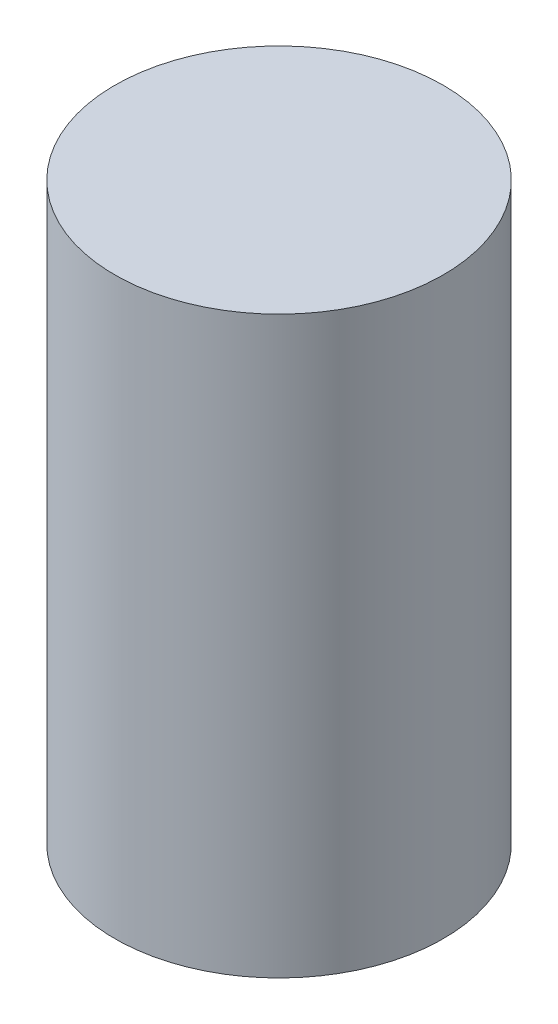
ISO-10303-21;
HEADER;
FILE_DESCRIPTION(('STEP AP214'),'2;1');
FILE_NAME('part.step','',(''),(''),'','','');
FILE_SCHEMA(('AUTOMOTIVE_DESIGN { 1 0 10303 214 1 1 1 1 }'));
ENDSEC;
DATA;
#1=APPLICATION_CONTEXT('core data for automotive mechanical design processes');
#2=APPLICATION_PROTOCOL_DEFINITION('international standard','automotive_design',2000,#1);
#3=PRODUCT_CONTEXT('',#1,'mechanical');
#4=PRODUCT('Part','Part','',(#3));
#5=PRODUCT_RELATED_PRODUCT_CATEGORY('part','',(#4));
#6=PRODUCT_DEFINITION_FORMATION('','',#4);
#7=PRODUCT_DEFINITION_CONTEXT('part definition',#1,'design');
#8=PRODUCT_DEFINITION('design','',#6,#7);
#9=PRODUCT_DEFINITION_SHAPE('','',#8);
#10=(LENGTH_UNIT() NAMED_UNIT(*) SI_UNIT(.MILLI.,.METRE.));
#11=(NAMED_UNIT(*) PLANE_ANGLE_UNIT() SI_UNIT($,.RADIAN.));
#12=(NAMED_UNIT(*) SI_UNIT($,.STERADIAN.) SOLID_ANGLE_UNIT());
#13=UNCERTAINTY_MEASURE_WITH_UNIT(LENGTH_MEASURE(1.E-05),#10,'distance_accuracy_value','');
#14=(GEOMETRIC_REPRESENTATION_CONTEXT(3) GLOBAL_UNCERTAINTY_ASSIGNED_CONTEXT((#13)) GLOBAL_UNIT_ASSIGNED_CONTEXT((#10,
#11,#12)) REPRESENTATION_CONTEXT('',''));
#15=CARTESIAN_POINT('',(0.,0.,0.));
#16=DIRECTION('',(0.,0.,1.));
#17=DIRECTION('',(1.,0.,0.));
#18=AXIS2_PLACEMENT_3D('',#15,#16,#17);
#19=CARTESIAN_POINT('',(10.,0.,0.));
#20=DIRECTION('',(0.,-1.,0.));
#21=DIRECTION('',(0.,0.,-1.));
#22=AXIS2_PLACEMENT_3D('',#19,#20,#21);
#23=PLANE('',#22);
#24=CARTESIAN_POINT('',(0.,0.,0.));
#25=DIRECTION('',(0.,-1.,0.));
#26=DIRECTION('',(0.,0.,-1.));
#27=AXIS2_PLACEMENT_3D('',#24,#25,#26);
#28=CIRCLE('',#27,10.);
#29=CARTESIAN_POINT('',(0.,0.,-10.));
#30=VERTEX_POINT('',#29);
#31=EDGE_CURVE('E36',#30,#30,#28,.T.);
#32=ORIENTED_EDGE('',*,*,#31,.T.);
#33=EDGE_LOOP('',(#32));
#34=FACE_BOUND('',#33,.T.);
#35=ADVANCED_FACE('F30',(#34),#23,.T.);
#36=CARTESIAN_POINT('',(0.,35.,0.));
#37=DIRECTION('',(0.,1.,0.));
#38=DIRECTION('',(0.,0.,1.));
#39=AXIS2_PLACEMENT_3D('',#36,#37,#38);
#40=PLANE('',#39);
#41=CARTESIAN_POINT('',(0.,35.,0.));
#42=DIRECTION('',(0.,-1.,0.));
#43=DIRECTION('',(0.,0.,-1.));
#44=AXIS2_PLACEMENT_3D('',#41,#42,#43);
#45=CIRCLE('',#44,9.99999999999999);
#46=CARTESIAN_POINT('',(0.,35.,-9.99999999999999));
#47=VERTEX_POINT('',#46);
#48=EDGE_CURVE('E10',#47,#47,#45,.T.);
#49=ORIENTED_EDGE('',*,*,#48,.F.);
#50=EDGE_LOOP('',(#49));
#51=FACE_BOUND('',#50,.T.);
#52=ADVANCED_FACE('F45',(#51),#40,.T.);
#53=CARTESIAN_POINT('',(0.,0.,0.));
#54=DIRECTION('',(0.,-1.,0.));
#55=DIRECTION('',(0.,0.,-1.));
#56=AXIS2_PLACEMENT_3D('',#53,#54,#55);
#57=CYLINDRICAL_SURFACE('',#56,9.99999999999999);
#58=ORIENTED_EDGE('',*,*,#48,.T.);
#59=EDGE_LOOP('',(#58));
#60=FACE_BOUND('',#59,.T.);
#61=ORIENTED_EDGE('',*,*,#31,.F.);
#62=EDGE_LOOP('',(#61));
#63=FACE_BOUND('',#62,.T.);
#64=ADVANCED_FACE('F43',(#60,#63),#57,.T.);
#65=CLOSED_SHELL('',(#35,#52,#64));
#66=MANIFOLD_SOLID_BREP('B2',#65);
#67=ADVANCED_BREP_SHAPE_REPRESENTATION('',(#18,#66),#14);
#68=SHAPE_DEFINITION_REPRESENTATION(#9,#67);
ENDSEC;
END-ISO-10303-21;
